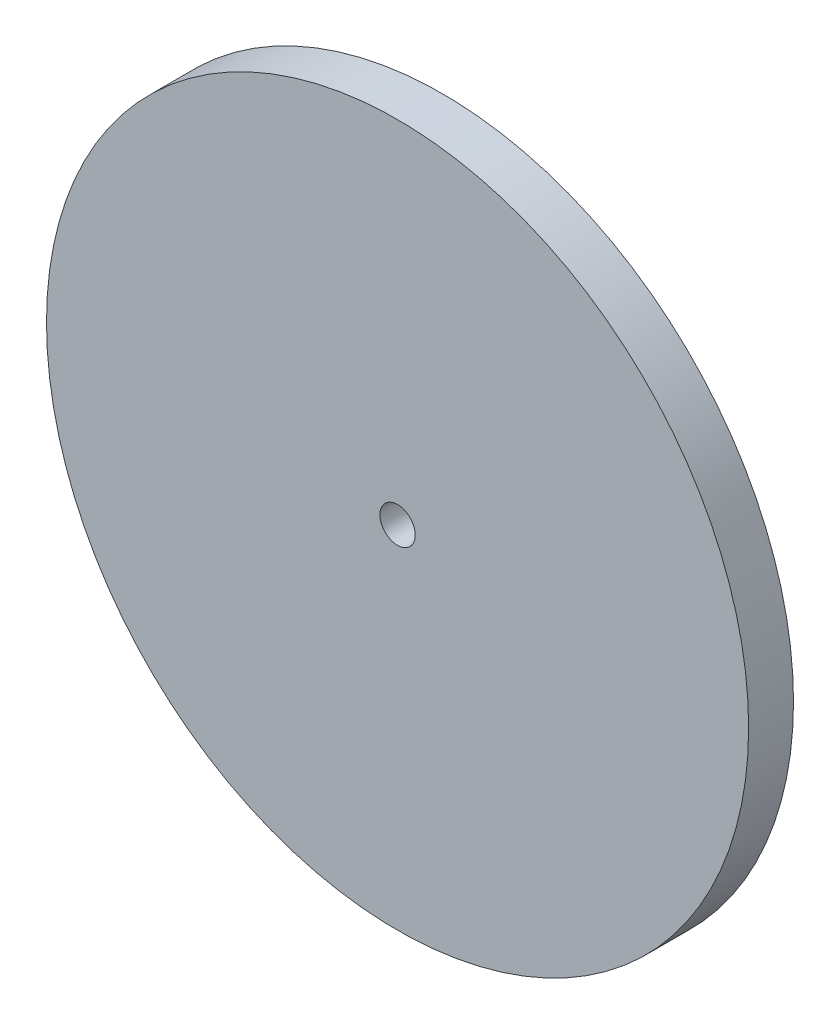
ISO-10303-21;
HEADER;
FILE_DESCRIPTION(('STEP AP214'),'2;1');
FILE_NAME('part.step','',(''),(''),'','','');
FILE_SCHEMA(('AUTOMOTIVE_DESIGN { 1 0 10303 214 1 1 1 1 }'));
ENDSEC;
DATA;
#1=APPLICATION_CONTEXT('core data for automotive mechanical design processes');
#2=APPLICATION_PROTOCOL_DEFINITION('international standard','automotive_design',2000,#1);
#3=PRODUCT_CONTEXT('',#1,'mechanical');
#4=PRODUCT('Part','Part','',(#3));
#5=PRODUCT_RELATED_PRODUCT_CATEGORY('part','',(#4));
#6=PRODUCT_DEFINITION_FORMATION('','',#4);
#7=PRODUCT_DEFINITION_CONTEXT('part definition',#1,'design');
#8=PRODUCT_DEFINITION('design','',#6,#7);
#9=PRODUCT_DEFINITION_SHAPE('','',#8);
#10=(LENGTH_UNIT() NAMED_UNIT(*) SI_UNIT(.MILLI.,.METRE.));
#11=(NAMED_UNIT(*) PLANE_ANGLE_UNIT() SI_UNIT($,.RADIAN.));
#12=(NAMED_UNIT(*) SI_UNIT($,.STERADIAN.) SOLID_ANGLE_UNIT());
#13=UNCERTAINTY_MEASURE_WITH_UNIT(LENGTH_MEASURE(1.E-05),#10,'distance_accuracy_value','');
#14=(GEOMETRIC_REPRESENTATION_CONTEXT(3) GLOBAL_UNCERTAINTY_ASSIGNED_CONTEXT((#13)) GLOBAL_UNIT_ASSIGNED_CONTEXT((#10,
#11,#12)) REPRESENTATION_CONTEXT('',''));
#15=CARTESIAN_POINT('',(0.,0.,0.));
#16=DIRECTION('',(0.,0.,1.));
#17=DIRECTION('',(1.,0.,0.));
#18=AXIS2_PLACEMENT_3D('',#15,#16,#17);
#19=CARTESIAN_POINT('',(0.,0.,5.08));
#20=DIRECTION('',(0.,0.,-1.));
#21=DIRECTION('',(-1.,0.,0.));
#22=AXIS2_PLACEMENT_3D('',#19,#20,#21);
#23=CYLINDRICAL_SURFACE('',#22,39.75);
#24=CARTESIAN_POINT('',(0.,0.,5.08));
#25=DIRECTION('',(0.,0.,1.));
#26=DIRECTION('',(1.,0.,0.));
#27=AXIS2_PLACEMENT_3D('',#24,#25,#26);
#28=CIRCLE('',#27,39.75);
#29=CARTESIAN_POINT('',(39.75,0.,5.08));
#30=VERTEX_POINT('',#29);
#31=EDGE_CURVE('E12',#30,#30,#28,.T.);
#32=ORIENTED_EDGE('',*,*,#31,.F.);
#33=EDGE_LOOP('',(#32));
#34=FACE_BOUND('',#33,.T.);
#35=CARTESIAN_POINT('',(0.,0.,0.));
#36=DIRECTION('',(0.,0.,1.));
#37=DIRECTION('',(1.,0.,0.));
#38=AXIS2_PLACEMENT_3D('',#35,#36,#37);
#39=CIRCLE('',#38,39.75);
#40=CARTESIAN_POINT('',(39.75,0.,0.));
#41=VERTEX_POINT('',#40);
#42=EDGE_CURVE('E57',#41,#41,#39,.T.);
#43=ORIENTED_EDGE('',*,*,#42,.T.);
#44=EDGE_LOOP('',(#43));
#45=FACE_BOUND('',#44,.T.);
#46=ADVANCED_FACE('F49',(#34,#45),#23,.T.);
#47=CARTESIAN_POINT('',(0.,0.,5.08));
#48=DIRECTION('',(0.,0.,1.));
#49=DIRECTION('',(1.,0.,0.));
#50=AXIS2_PLACEMENT_3D('',#47,#48,#49);
#51=PLANE('',#50);
#52=CARTESIAN_POINT('',(0.,0.,5.08));
#53=DIRECTION('',(0.,0.,1.));
#54=DIRECTION('',(1.,0.,0.));
#55=AXIS2_PLACEMENT_3D('',#52,#53,#54);
#56=CIRCLE('',#55,2.);
#57=CARTESIAN_POINT('',(2.,0.,5.08));
#58=VERTEX_POINT('',#57);
#59=EDGE_CURVE('E64',#58,#58,#56,.T.);
#60=ORIENTED_EDGE('',*,*,#59,.F.);
#61=EDGE_LOOP('',(#60));
#62=FACE_BOUND('',#61,.T.);
#63=ORIENTED_EDGE('',*,*,#31,.T.);
#64=EDGE_LOOP('',(#63));
#65=FACE_BOUND('',#64,.T.);
#66=ADVANCED_FACE('F82',(#62,#65),#51,.T.);
#67=CARTESIAN_POINT('',(0.,0.,0.));
#68=DIRECTION('',(0.,0.,1.));
#69=DIRECTION('',(1.,0.,0.));
#70=AXIS2_PLACEMENT_3D('',#67,#68,#69);
#71=PLANE('',#70);
#72=CARTESIAN_POINT('',(0.,0.,0.));
#73=DIRECTION('',(0.,0.,1.));
#74=DIRECTION('',(1.,0.,0.));
#75=AXIS2_PLACEMENT_3D('',#72,#73,#74);
#76=CIRCLE('',#75,2.);
#77=CARTESIAN_POINT('',(2.,0.,0.));
#78=VERTEX_POINT('',#77);
#79=EDGE_CURVE('E52',#78,#78,#76,.T.);
#80=ORIENTED_EDGE('',*,*,#79,.T.);
#81=EDGE_LOOP('',(#80));
#82=FACE_BOUND('',#81,.T.);
#83=ORIENTED_EDGE('',*,*,#42,.F.);
#84=EDGE_LOOP('',(#83));
#85=FACE_BOUND('',#84,.T.);
#86=ADVANCED_FACE('F73',(#82,#85),#71,.F.);
#87=CARTESIAN_POINT('',(0.,0.,-4.92));
#88=DIRECTION('',(0.,0.,1.));
#89=DIRECTION('',(1.,0.,0.));
#90=AXIS2_PLACEMENT_3D('',#87,#88,#89);
#91=CYLINDRICAL_SURFACE('',#90,2.);
#92=ORIENTED_EDGE('',*,*,#59,.T.);
#93=EDGE_LOOP('',(#92));
#94=FACE_BOUND('',#93,.T.);
#95=ORIENTED_EDGE('',*,*,#79,.F.);
#96=EDGE_LOOP('',(#95));
#97=FACE_BOUND('',#96,.T.);
#98=ADVANCED_FACE('F76',(#94,#97),#91,.F.);
#99=CLOSED_SHELL('',(#46,#66,#86,#98));
#100=MANIFOLD_SOLID_BREP('B2',#99);
#101=ADVANCED_BREP_SHAPE_REPRESENTATION('',(#18,#100),#14);
#102=SHAPE_DEFINITION_REPRESENTATION(#9,#101);
ENDSEC;
END-ISO-10303-21;
